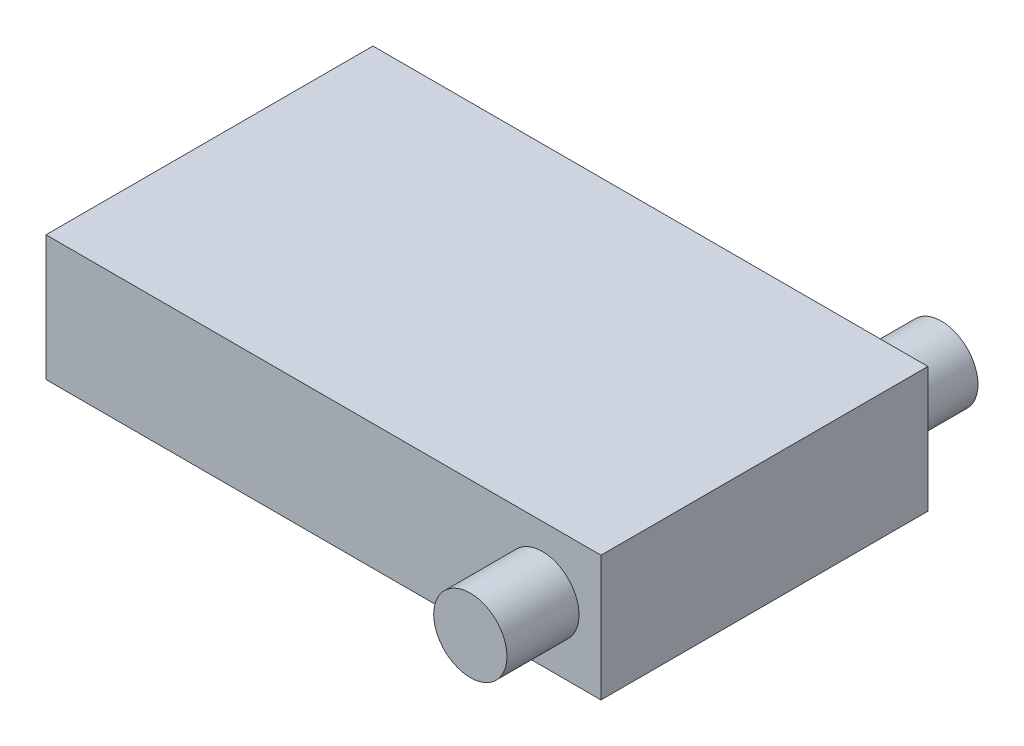
ISO-10303-21;
HEADER;
FILE_DESCRIPTION(('STEP AP214'),'2;1');
FILE_NAME('part.step','',(''),(''),'','','');
FILE_SCHEMA(('AUTOMOTIVE_DESIGN { 1 0 10303 214 1 1 1 1 }'));
ENDSEC;
DATA;
#1=APPLICATION_CONTEXT('core data for automotive mechanical design processes');
#2=APPLICATION_PROTOCOL_DEFINITION('international standard','automotive_design',2000,#1);
#3=PRODUCT_CONTEXT('',#1,'mechanical');
#4=PRODUCT('Part','Part','',(#3));
#5=PRODUCT_RELATED_PRODUCT_CATEGORY('part','',(#4));
#6=PRODUCT_DEFINITION_FORMATION('','',#4);
#7=PRODUCT_DEFINITION_CONTEXT('part definition',#1,'design');
#8=PRODUCT_DEFINITION('design','',#6,#7);
#9=PRODUCT_DEFINITION_SHAPE('','',#8);
#10=(LENGTH_UNIT() NAMED_UNIT(*) SI_UNIT(.MILLI.,.METRE.));
#11=(NAMED_UNIT(*) PLANE_ANGLE_UNIT() SI_UNIT($,.RADIAN.));
#12=(NAMED_UNIT(*) SI_UNIT($,.STERADIAN.) SOLID_ANGLE_UNIT());
#13=UNCERTAINTY_MEASURE_WITH_UNIT(LENGTH_MEASURE(1.E-05),#10,'distance_accuracy_value','');
#14=(GEOMETRIC_REPRESENTATION_CONTEXT(3) GLOBAL_UNCERTAINTY_ASSIGNED_CONTEXT((#13)) GLOBAL_UNIT_ASSIGNED_CONTEXT((#10,
#11,#12)) REPRESENTATION_CONTEXT('',''));
#15=CARTESIAN_POINT('',(0.,0.,0.));
#16=DIRECTION('',(0.,0.,1.));
#17=DIRECTION('',(1.,0.,0.));
#18=AXIS2_PLACEMENT_3D('',#15,#16,#17);
#19=CARTESIAN_POINT('',(-23.68,5.35,-13.95));
#20=DIRECTION('',(1.,0.,0.));
#21=DIRECTION('',(0.,0.,-1.));
#22=AXIS2_PLACEMENT_3D('',#19,#20,#21);
#23=PLANE('',#22);
#24=DIRECTION('',(0.,0.,-1.));
#25=VECTOR('',#24,1.);
#26=CARTESIAN_POINT('',(-23.68,0.95,-10.25));
#27=LINE('',#26,#25);
#28=CARTESIAN_POINT('',(-23.68,0.95,9.85));
#29=VERTEX_POINT('',#28);
#30=CARTESIAN_POINT('',(-23.68,0.95,-10.25));
#31=VERTEX_POINT('',#30);
#32=EDGE_CURVE('E175',#29,#31,#27,.T.);
#33=ORIENTED_EDGE('',*,*,#32,.F.);
#34=DIRECTION('',(0.,1.,0.));
#35=VECTOR('',#34,1.);
#36=CARTESIAN_POINT('',(-23.68,0.95,9.85));
#37=LINE('',#36,#35);
#38=CARTESIAN_POINT('',(-23.68,-2.25,9.85));
#39=VERTEX_POINT('',#38);
#40=EDGE_CURVE('E138',#39,#29,#37,.T.);
#41=ORIENTED_EDGE('',*,*,#40,.F.);
#42=DIRECTION('',(0.,0.,1.));
#43=VECTOR('',#42,1.);
#44=CARTESIAN_POINT('',(-23.68,-2.25,0.950000000000002));
#45=LINE('',#44,#43);
#46=CARTESIAN_POINT('',(-23.68,-2.25,0.950000000000002));
#47=VERTEX_POINT('',#46);
#48=EDGE_CURVE('E274',#47,#39,#45,.T.);
#49=ORIENTED_EDGE('',*,*,#48,.F.);
#50=DIRECTION('',(0.,1.,0.));
#51=VECTOR('',#50,1.);
#52=CARTESIAN_POINT('',(-23.68,0.95,0.950000000000001));
#53=LINE('',#52,#51);
#54=CARTESIAN_POINT('',(-23.68,-4.05,0.950000000000002));
#55=VERTEX_POINT('',#54);
#56=EDGE_CURVE('E147',#55,#47,#53,.T.);
#57=ORIENTED_EDGE('',*,*,#56,.F.);
#58=DIRECTION('',(0.,0.,1.));
#59=VECTOR('',#58,1.);
#60=CARTESIAN_POINT('',(-23.68,-4.05,-10.25));
#61=LINE('',#60,#59);
#62=CARTESIAN_POINT('',(-23.68,-4.05,-10.25));
#63=VERTEX_POINT('',#62);
#64=EDGE_CURVE('E168',#63,#55,#61,.T.);
#65=ORIENTED_EDGE('',*,*,#64,.F.);
#66=DIRECTION('',(0.,-1.,0.));
#67=VECTOR('',#66,1.);
#68=CARTESIAN_POINT('',(-23.68,0.95,-10.25));
#69=LINE('',#68,#67);
#70=EDGE_CURVE('E54',#31,#63,#69,.T.);
#71=ORIENTED_EDGE('',*,*,#70,.F.);
#72=EDGE_LOOP('',(#33,#41,#49,#57,#65,#71));
#73=FACE_BOUND('',#72,.T.);
#74=DIRECTION('',(0.,0.,1.));
#75=VECTOR('',#74,1.);
#76=CARTESIAN_POINT('',(-23.68,-5.35,-13.95));
#77=LINE('',#76,#75);
#78=CARTESIAN_POINT('',(-23.68,-5.35,-13.95));
#79=VERTEX_POINT('',#78);
#80=CARTESIAN_POINT('',(-23.68,-5.35,13.95));
#81=VERTEX_POINT('',#80);
#82=EDGE_CURVE('E196',#79,#81,#77,.T.);
#83=ORIENTED_EDGE('',*,*,#82,.T.);
#84=DIRECTION('',(0.,-1.,0.));
#85=VECTOR('',#84,1.);
#86=CARTESIAN_POINT('',(-23.68,5.35,13.95));
#87=LINE('',#86,#85);
#88=CARTESIAN_POINT('',(-23.68,5.35,13.95));
#89=VERTEX_POINT('',#88);
#90=EDGE_CURVE('E47',#89,#81,#87,.T.);
#91=ORIENTED_EDGE('',*,*,#90,.F.);
#92=DIRECTION('',(0.,0.,1.));
#93=VECTOR('',#92,1.);
#94=CARTESIAN_POINT('',(-23.68,5.35,-13.95));
#95=LINE('',#94,#93);
#96=CARTESIAN_POINT('',(-23.68,5.35,-13.95));
#97=VERTEX_POINT('',#96);
#98=EDGE_CURVE('E200',#97,#89,#95,.T.);
#99=ORIENTED_EDGE('',*,*,#98,.F.);
#100=DIRECTION('',(0.,-1.,0.));
#101=VECTOR('',#100,1.);
#102=CARTESIAN_POINT('',(-23.68,5.35,-13.95));
#103=LINE('',#102,#101);
#104=EDGE_CURVE('E210',#97,#79,#103,.T.);
#105=ORIENTED_EDGE('',*,*,#104,.T.);
#106=EDGE_LOOP('',(#83,#91,#99,#105));
#107=FACE_BOUND('',#106,.T.);
#108=ADVANCED_FACE('F39',(#73,#107),#23,.F.);
#109=CARTESIAN_POINT('',(-23.68,5.35,13.95));
#110=DIRECTION('',(0.,0.,-1.));
#111=DIRECTION('',(-1.,0.,0.));
#112=AXIS2_PLACEMENT_3D('',#109,#110,#111);
#113=PLANE('',#112);
#114=CARTESIAN_POINT('',(18.68,0.,13.95));
#115=DIRECTION('',(0.,0.,-1.));
#116=DIRECTION('',(-1.,0.,0.));
#117=AXIS2_PLACEMENT_3D('',#114,#115,#116);
#118=CIRCLE('',#117,3.125);
#119=CARTESIAN_POINT('',(15.555,0.,13.95));
#120=VERTEX_POINT('',#119);
#121=EDGE_CURVE('E11',#120,#120,#118,.F.);
#122=ORIENTED_EDGE('',*,*,#121,.F.);
#123=EDGE_LOOP('',(#122));
#124=FACE_BOUND('',#123,.T.);
#125=DIRECTION('',(1.,0.,0.));
#126=VECTOR('',#125,1.);
#127=CARTESIAN_POINT('',(-23.68,-5.35,13.95));
#128=LINE('',#127,#126);
#129=CARTESIAN_POINT('',(23.68,-5.35,13.95));
#130=VERTEX_POINT('',#129);
#131=EDGE_CURVE('E214',#81,#130,#128,.T.);
#132=ORIENTED_EDGE('',*,*,#131,.T.);
#133=DIRECTION('',(0.,-1.,0.));
#134=VECTOR('',#133,1.);
#135=CARTESIAN_POINT('',(23.68,5.35,13.95));
#136=LINE('',#135,#134);
#137=CARTESIAN_POINT('',(23.68,5.35,13.95));
#138=VERTEX_POINT('',#137);
#139=EDGE_CURVE('E227',#138,#130,#136,.T.);
#140=ORIENTED_EDGE('',*,*,#139,.F.);
#141=DIRECTION('',(1.,0.,0.));
#142=VECTOR('',#141,1.);
#143=CARTESIAN_POINT('',(-23.68,5.35,13.95));
#144=LINE('',#143,#142);
#145=EDGE_CURVE('E92',#89,#138,#144,.T.);
#146=ORIENTED_EDGE('',*,*,#145,.F.);
#147=ORIENTED_EDGE('',*,*,#90,.T.);
#148=EDGE_LOOP('',(#132,#140,#146,#147));
#149=FACE_BOUND('',#148,.T.);
#150=ADVANCED_FACE('F232',(#124,#149),#113,.F.);
#151=CARTESIAN_POINT('',(23.68,5.35,-13.95));
#152=DIRECTION('',(-1.,0.,0.));
#153=DIRECTION('',(0.,0.,1.));
#154=AXIS2_PLACEMENT_3D('',#151,#152,#153);
#155=PLANE('',#154);
#156=DIRECTION('',(0.,0.,-1.));
#157=VECTOR('',#156,1.);
#158=CARTESIAN_POINT('',(23.68,-5.35,-13.95));
#159=LINE('',#158,#157);
#160=CARTESIAN_POINT('',(23.68,-5.35,-13.95));
#161=VERTEX_POINT('',#160);
#162=EDGE_CURVE('E217',#130,#161,#159,.T.);
#163=ORIENTED_EDGE('',*,*,#162,.T.);
#164=DIRECTION('',(0.,-1.,0.));
#165=VECTOR('',#164,1.);
#166=CARTESIAN_POINT('',(23.68,5.35,-13.95));
#167=LINE('',#166,#165);
#168=CARTESIAN_POINT('',(23.68,5.35,-13.95));
#169=VERTEX_POINT('',#168);
#170=EDGE_CURVE('E224',#169,#161,#167,.T.);
#171=ORIENTED_EDGE('',*,*,#170,.F.);
#172=DIRECTION('',(0.,0.,-1.));
#173=VECTOR('',#172,1.);
#174=CARTESIAN_POINT('',(23.68,5.35,-13.95));
#175=LINE('',#174,#173);
#176=EDGE_CURVE('E205',#138,#169,#175,.T.);
#177=ORIENTED_EDGE('',*,*,#176,.F.);
#178=ORIENTED_EDGE('',*,*,#139,.T.);
#179=EDGE_LOOP('',(#163,#171,#177,#178));
#180=FACE_BOUND('',#179,.T.);
#181=ADVANCED_FACE('F241',(#180),#155,.F.);
#182=CARTESIAN_POINT('',(-23.68,5.35,-13.95));
#183=DIRECTION('',(0.,0.,1.));
#184=DIRECTION('',(1.,0.,0.));
#185=AXIS2_PLACEMENT_3D('',#182,#183,#184);
#186=PLANE('',#185);
#187=CARTESIAN_POINT('',(18.68,0.,-13.95));
#188=DIRECTION('',(0.,0.,1.));
#189=DIRECTION('',(1.,0.,0.));
#190=AXIS2_PLACEMENT_3D('',#187,#188,#189);
#191=CIRCLE('',#190,3.125);
#192=CARTESIAN_POINT('',(21.805,0.,-13.95));
#193=VERTEX_POINT('',#192);
#194=EDGE_CURVE('E191',#193,#193,#191,.T.);
#195=ORIENTED_EDGE('',*,*,#194,.T.);
#196=EDGE_LOOP('',(#195));
#197=FACE_BOUND('',#196,.T.);
#198=DIRECTION('',(-1.,0.,0.));
#199=VECTOR('',#198,1.);
#200=CARTESIAN_POINT('',(-23.68,-5.35,-13.95));
#201=LINE('',#200,#199);
#202=EDGE_CURVE('E84',#161,#79,#201,.T.);
#203=ORIENTED_EDGE('',*,*,#202,.T.);
#204=ORIENTED_EDGE('',*,*,#104,.F.);
#205=DIRECTION('',(-1.,0.,0.));
#206=VECTOR('',#205,1.);
#207=CARTESIAN_POINT('',(-23.68,5.35,-13.95));
#208=LINE('',#207,#206);
#209=EDGE_CURVE('E63',#169,#97,#208,.T.);
#210=ORIENTED_EDGE('',*,*,#209,.F.);
#211=ORIENTED_EDGE('',*,*,#170,.T.);
#212=EDGE_LOOP('',(#203,#204,#210,#211));
#213=FACE_BOUND('',#212,.T.);
#214=ADVANCED_FACE('F243',(#197,#213),#186,.F.);
#215=CARTESIAN_POINT('',(0.,5.35,0.));
#216=DIRECTION('',(0.,1.,0.));
#217=DIRECTION('',(0.,0.,1.));
#218=AXIS2_PLACEMENT_3D('',#215,#216,#217);
#219=PLANE('',#218);
#220=ORIENTED_EDGE('',*,*,#98,.T.);
#221=ORIENTED_EDGE('',*,*,#145,.T.);
#222=ORIENTED_EDGE('',*,*,#176,.T.);
#223=ORIENTED_EDGE('',*,*,#209,.T.);
#224=EDGE_LOOP('',(#220,#221,#222,#223));
#225=FACE_BOUND('',#224,.T.);
#226=ADVANCED_FACE('F244',(#225),#219,.T.);
#227=CARTESIAN_POINT('',(0.,-5.35,0.));
#228=DIRECTION('',(0.,1.,0.));
#229=DIRECTION('',(0.,0.,1.));
#230=AXIS2_PLACEMENT_3D('',#227,#228,#229);
#231=PLANE('',#230);
#232=ORIENTED_EDGE('',*,*,#82,.F.);
#233=ORIENTED_EDGE('',*,*,#202,.F.);
#234=ORIENTED_EDGE('',*,*,#162,.F.);
#235=ORIENTED_EDGE('',*,*,#131,.F.);
#236=EDGE_LOOP('',(#232,#233,#234,#235));
#237=FACE_BOUND('',#236,.T.);
#238=ADVANCED_FACE('F237',(#237),#231,.F.);
#239=CARTESIAN_POINT('',(18.68,0.,-20.1));
#240=DIRECTION('',(0.,0.,1.));
#241=DIRECTION('',(1.,0.,0.));
#242=AXIS2_PLACEMENT_3D('',#239,#240,#241);
#243=CYLINDRICAL_SURFACE('',#242,3.125);
#244=CARTESIAN_POINT('',(18.68,0.,-20.1));
#245=DIRECTION('',(0.,0.,1.));
#246=DIRECTION('',(1.,0.,0.));
#247=AXIS2_PLACEMENT_3D('',#244,#245,#246);
#248=CIRCLE('',#247,3.125);
#249=CARTESIAN_POINT('',(21.805,0.,-20.1));
#250=VERTEX_POINT('',#249);
#251=EDGE_CURVE('E192',#250,#250,#248,.T.);
#252=ORIENTED_EDGE('',*,*,#251,.T.);
#253=EDGE_LOOP('',(#252));
#254=FACE_BOUND('',#253,.T.);
#255=ORIENTED_EDGE('',*,*,#194,.F.);
#256=EDGE_LOOP('',(#255));
#257=FACE_BOUND('',#256,.T.);
#258=ADVANCED_FACE('F251',(#254,#257),#243,.T.);
#259=CARTESIAN_POINT('',(18.68,0.,-20.1));
#260=DIRECTION('',(0.,0.,1.));
#261=DIRECTION('',(1.,0.,0.));
#262=AXIS2_PLACEMENT_3D('',#259,#260,#261);
#263=PLANE('',#262);
#264=ORIENTED_EDGE('',*,*,#251,.F.);
#265=EDGE_LOOP('',(#264));
#266=FACE_BOUND('',#265,.T.);
#267=ADVANCED_FACE('F305',(#266),#263,.F.);
#268=CARTESIAN_POINT('',(18.68,0.,20.1));
#269=DIRECTION('',(0.,0.,-1.));
#270=DIRECTION('',(-1.,0.,0.));
#271=AXIS2_PLACEMENT_3D('',#268,#269,#270);
#272=CYLINDRICAL_SURFACE('',#271,3.125);
#273=CARTESIAN_POINT('',(18.68,0.,20.1));
#274=DIRECTION('',(0.,0.,1.));
#275=DIRECTION('',(1.,0.,0.));
#276=AXIS2_PLACEMENT_3D('',#273,#274,#275);
#277=CIRCLE('',#276,3.125);
#278=CARTESIAN_POINT('',(21.805,0.,20.1));
#279=VERTEX_POINT('',#278);
#280=EDGE_CURVE('E182',#279,#279,#277,.T.);
#281=ORIENTED_EDGE('',*,*,#280,.F.);
#282=EDGE_LOOP('',(#281));
#283=FACE_BOUND('',#282,.T.);
#284=ORIENTED_EDGE('',*,*,#121,.T.);
#285=EDGE_LOOP('',(#284));
#286=FACE_BOUND('',#285,.T.);
#287=ADVANCED_FACE('F301',(#283,#286),#272,.T.);
#288=CARTESIAN_POINT('',(18.68,0.,20.1));
#289=DIRECTION('',(0.,0.,-1.));
#290=DIRECTION('',(1.,0.,0.));
#291=AXIS2_PLACEMENT_3D('',#288,#289,#290);
#292=PLANE('',#291);
#293=ORIENTED_EDGE('',*,*,#280,.T.);
#294=EDGE_LOOP('',(#293));
#295=FACE_BOUND('',#294,.T.);
#296=ADVANCED_FACE('F298',(#295),#292,.F.);
#297=CARTESIAN_POINT('',(-22.68,0.95,-10.25));
#298=DIRECTION('',(0.,0.,-1.));
#299=DIRECTION('',(-1.,0.,0.));
#300=AXIS2_PLACEMENT_3D('',#297,#298,#299);
#301=PLANE('',#300);
#302=ORIENTED_EDGE('',*,*,#70,.T.);
#303=DIRECTION('',(-1.,0.,0.));
#304=VECTOR('',#303,1.);
#305=CARTESIAN_POINT('',(-22.68,-4.05,-10.25));
#306=LINE('',#305,#304);
#307=CARTESIAN_POINT('',(-22.68,-4.05,-10.25));
#308=VERTEX_POINT('',#307);
#309=EDGE_CURVE('E160',#308,#63,#306,.T.);
#310=ORIENTED_EDGE('',*,*,#309,.F.);
#311=DIRECTION('',(0.,-1.,0.));
#312=VECTOR('',#311,1.);
#313=CARTESIAN_POINT('',(-22.68,0.95,-10.25));
#314=LINE('',#313,#312);
#315=CARTESIAN_POINT('',(-22.68,0.95,-10.25));
#316=VERTEX_POINT('',#315);
#317=EDGE_CURVE('E162',#316,#308,#314,.T.);
#318=ORIENTED_EDGE('',*,*,#317,.F.);
#319=DIRECTION('',(-1.,0.,0.));
#320=VECTOR('',#319,1.);
#321=CARTESIAN_POINT('',(-22.68,0.95,-10.25));
#322=LINE('',#321,#320);
#323=EDGE_CURVE('E179',#316,#31,#322,.T.);
#324=ORIENTED_EDGE('',*,*,#323,.T.);
#325=EDGE_LOOP('',(#302,#310,#318,#324));
#326=FACE_BOUND('',#325,.T.);
#327=ADVANCED_FACE('F283',(#326),#301,.F.);
#328=CARTESIAN_POINT('',(-22.68,0.95,-10.25));
#329=DIRECTION('',(0.,1.,0.));
#330=DIRECTION('',(0.,0.,1.));
#331=AXIS2_PLACEMENT_3D('',#328,#329,#330);
#332=PLANE('',#331);
#333=ORIENTED_EDGE('',*,*,#32,.T.);
#334=ORIENTED_EDGE('',*,*,#323,.F.);
#335=DIRECTION('',(0.,0.,-1.));
#336=VECTOR('',#335,1.);
#337=CARTESIAN_POINT('',(-22.68,0.95,-10.25));
#338=LINE('',#337,#336);
#339=CARTESIAN_POINT('',(-22.68,0.95,9.85));
#340=VERTEX_POINT('',#339);
#341=EDGE_CURVE('E155',#340,#316,#338,.T.);
#342=ORIENTED_EDGE('',*,*,#341,.F.);
#343=DIRECTION('',(-1.,0.,0.));
#344=VECTOR('',#343,1.);
#345=CARTESIAN_POINT('',(-22.68,0.95,9.85));
#346=LINE('',#345,#344);
#347=EDGE_CURVE('E169',#340,#29,#346,.T.);
#348=ORIENTED_EDGE('',*,*,#347,.T.);
#349=EDGE_LOOP('',(#333,#334,#342,#348));
#350=FACE_BOUND('',#349,.T.);
#351=ADVANCED_FACE('F268',(#350),#332,.F.);
#352=CARTESIAN_POINT('',(-22.68,0.95,0.950000000000001));
#353=DIRECTION('',(0.,0.,1.));
#354=DIRECTION('',(0.,-1.,0.));
#355=AXIS2_PLACEMENT_3D('',#352,#353,#354);
#356=PLANE('',#355);
#357=ORIENTED_EDGE('',*,*,#56,.T.);
#358=DIRECTION('',(-1.,0.,0.));
#359=VECTOR('',#358,1.);
#360=CARTESIAN_POINT('',(-22.68,-2.25,0.950000000000002));
#361=LINE('',#360,#359);
#362=CARTESIAN_POINT('',(-22.68,-2.25,0.950000000000002));
#363=VERTEX_POINT('',#362);
#364=EDGE_CURVE('E129',#363,#47,#361,.T.);
#365=ORIENTED_EDGE('',*,*,#364,.F.);
#366=DIRECTION('',(0.,1.,0.));
#367=VECTOR('',#366,1.);
#368=CARTESIAN_POINT('',(-22.68,0.95,0.950000000000001));
#369=LINE('',#368,#367);
#370=CARTESIAN_POINT('',(-22.68,-4.05,0.950000000000002));
#371=VERTEX_POINT('',#370);
#372=EDGE_CURVE('E144',#371,#363,#369,.T.);
#373=ORIENTED_EDGE('',*,*,#372,.F.);
#374=DIRECTION('',(-1.,0.,0.));
#375=VECTOR('',#374,1.);
#376=CARTESIAN_POINT('',(-22.68,-4.05,0.950000000000002));
#377=LINE('',#376,#375);
#378=EDGE_CURVE('E183',#371,#55,#377,.T.);
#379=ORIENTED_EDGE('',*,*,#378,.T.);
#380=EDGE_LOOP('',(#357,#365,#373,#379));
#381=FACE_BOUND('',#380,.T.);
#382=ADVANCED_FACE('F143',(#381),#356,.F.);
#383=CARTESIAN_POINT('',(-22.68,-4.05,-10.25));
#384=DIRECTION('',(0.,-1.,0.));
#385=DIRECTION('',(0.,0.,-1.));
#386=AXIS2_PLACEMENT_3D('',#383,#384,#385);
#387=PLANE('',#386);
#388=ORIENTED_EDGE('',*,*,#64,.T.);
#389=ORIENTED_EDGE('',*,*,#378,.F.);
#390=DIRECTION('',(0.,0.,1.));
#391=VECTOR('',#390,1.);
#392=CARTESIAN_POINT('',(-22.68,-4.05,-10.25));
#393=LINE('',#392,#391);
#394=EDGE_CURVE('E153',#308,#371,#393,.T.);
#395=ORIENTED_EDGE('',*,*,#394,.F.);
#396=ORIENTED_EDGE('',*,*,#309,.T.);
#397=EDGE_LOOP('',(#388,#389,#395,#396));
#398=FACE_BOUND('',#397,.T.);
#399=ADVANCED_FACE('F285',(#398),#387,.F.);
#400=CARTESIAN_POINT('',(-22.68,0.,0.));
#401=DIRECTION('',(-1.,0.,0.));
#402=DIRECTION('',(0.,0.,1.));
#403=AXIS2_PLACEMENT_3D('',#400,#401,#402);
#404=PLANE('',#403);
#405=ORIENTED_EDGE('',*,*,#317,.T.);
#406=ORIENTED_EDGE('',*,*,#394,.T.);
#407=ORIENTED_EDGE('',*,*,#372,.T.);
#408=DIRECTION('',(0.,0.,1.));
#409=VECTOR('',#408,1.);
#410=CARTESIAN_POINT('',(-22.68,-2.25,0.950000000000002));
#411=LINE('',#410,#409);
#412=CARTESIAN_POINT('',(-22.68,-2.25,9.85));
#413=VERTEX_POINT('',#412);
#414=EDGE_CURVE('E125',#363,#413,#411,.T.);
#415=ORIENTED_EDGE('',*,*,#414,.T.);
#416=DIRECTION('',(0.,1.,0.));
#417=VECTOR('',#416,1.);
#418=CARTESIAN_POINT('',(-22.68,0.95,9.85));
#419=LINE('',#418,#417);
#420=EDGE_CURVE('E137',#413,#340,#419,.T.);
#421=ORIENTED_EDGE('',*,*,#420,.T.);
#422=ORIENTED_EDGE('',*,*,#341,.T.);
#423=EDGE_LOOP('',(#405,#406,#407,#415,#421,#422));
#424=FACE_BOUND('',#423,.T.);
#425=ADVANCED_FACE('F151',(#424),#404,.T.);
#426=CARTESIAN_POINT('',(-22.68,0.95,9.85));
#427=DIRECTION('',(0.,0.,1.));
#428=DIRECTION('',(1.,0.,0.));
#429=AXIS2_PLACEMENT_3D('',#426,#427,#428);
#430=PLANE('',#429);
#431=ORIENTED_EDGE('',*,*,#40,.T.);
#432=ORIENTED_EDGE('',*,*,#347,.F.);
#433=ORIENTED_EDGE('',*,*,#420,.F.);
#434=DIRECTION('',(-1.,0.,0.));
#435=VECTOR('',#434,1.);
#436=CARTESIAN_POINT('',(-22.68,-2.25,9.85));
#437=LINE('',#436,#435);
#438=EDGE_CURVE('E131',#413,#39,#437,.T.);
#439=ORIENTED_EDGE('',*,*,#438,.T.);
#440=EDGE_LOOP('',(#431,#432,#433,#439));
#441=FACE_BOUND('',#440,.T.);
#442=ADVANCED_FACE('F272',(#441),#430,.F.);
#443=CARTESIAN_POINT('',(-22.68,-2.25,0.950000000000002));
#444=DIRECTION('',(0.,-1.,0.));
#445=DIRECTION('',(0.,0.,-1.));
#446=AXIS2_PLACEMENT_3D('',#443,#444,#445);
#447=PLANE('',#446);
#448=ORIENTED_EDGE('',*,*,#48,.T.);
#449=ORIENTED_EDGE('',*,*,#438,.F.);
#450=ORIENTED_EDGE('',*,*,#414,.F.);
#451=ORIENTED_EDGE('',*,*,#364,.T.);
#452=EDGE_LOOP('',(#448,#449,#450,#451));
#453=FACE_BOUND('',#452,.T.);
#454=ADVANCED_FACE('F128',(#453),#447,.F.);
#455=CLOSED_SHELL('',(#108,#150,#181,#214,#226,#238,#258,#267,#287,#296,#327,#351,#382,#399,
#425,#442,#454));
#456=MANIFOLD_SOLID_BREP('B2',#455);
#457=ADVANCED_BREP_SHAPE_REPRESENTATION('',(#18,#456),#14);
#458=SHAPE_DEFINITION_REPRESENTATION(#9,#457);
ENDSEC;
END-ISO-10303-21;
